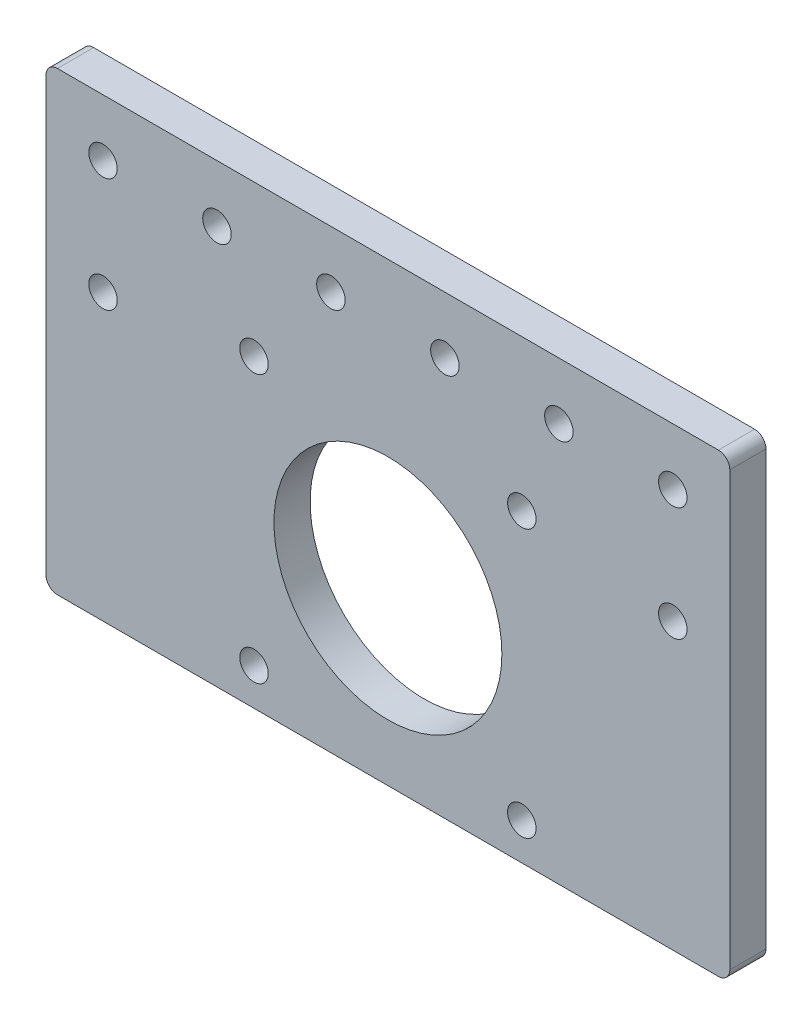
ISO-10303-21;
HEADER;
FILE_DESCRIPTION(('STEP AP214'),'2;1');
FILE_NAME('part.step','',(''),(''),'','','');
FILE_SCHEMA(('AUTOMOTIVE_DESIGN { 1 0 10303 214 1 1 1 1 }'));
ENDSEC;
DATA;
#1=APPLICATION_CONTEXT('core data for automotive mechanical design processes');
#2=APPLICATION_PROTOCOL_DEFINITION('international standard','automotive_design',2000,#1);
#3=PRODUCT_CONTEXT('',#1,'mechanical');
#4=PRODUCT('Part','Part','',(#3));
#5=PRODUCT_RELATED_PRODUCT_CATEGORY('part','',(#4));
#6=PRODUCT_DEFINITION_FORMATION('','',#4);
#7=PRODUCT_DEFINITION_CONTEXT('part definition',#1,'design');
#8=PRODUCT_DEFINITION('design','',#6,#7);
#9=PRODUCT_DEFINITION_SHAPE('','',#8);
#10=(LENGTH_UNIT() NAMED_UNIT(*) SI_UNIT(.MILLI.,.METRE.));
#11=(NAMED_UNIT(*) PLANE_ANGLE_UNIT() SI_UNIT($,.RADIAN.));
#12=(NAMED_UNIT(*) SI_UNIT($,.STERADIAN.) SOLID_ANGLE_UNIT());
#13=UNCERTAINTY_MEASURE_WITH_UNIT(LENGTH_MEASURE(1.E-05),#10,'distance_accuracy_value','');
#14=(GEOMETRIC_REPRESENTATION_CONTEXT(3) GLOBAL_UNCERTAINTY_ASSIGNED_CONTEXT((#13)) GLOBAL_UNIT_ASSIGNED_CONTEXT((#10,
#11,#12)) REPRESENTATION_CONTEXT('',''));
#15=CARTESIAN_POINT('',(0.,0.,0.));
#16=DIRECTION('',(0.,0.,1.));
#17=DIRECTION('',(1.,0.,0.));
#18=AXIS2_PLACEMENT_3D('',#15,#16,#17);
#19=CARTESIAN_POINT('',(0.,0.,6.35));
#20=DIRECTION('',(0.,0.,1.));
#21=DIRECTION('',(1.,0.,0.));
#22=AXIS2_PLACEMENT_3D('',#19,#20,#21);
#23=PLANE('',#22);
#24=CARTESIAN_POINT('',(23.5000000000005,-33.4999999999995,6.35));
#25=DIRECTION('',(0.,0.,1.));
#26=DIRECTION('',(1.,0.,0.));
#27=AXIS2_PLACEMENT_3D('',#24,#25,#26);
#28=CIRCLE('',#27,2.5);
#29=CARTESIAN_POINT('',(26.0000000000005,-33.4999999999995,6.35));
#30=VERTEX_POINT('',#29);
#31=EDGE_CURVE('E244',#30,#30,#28,.T.);
#32=ORIENTED_EDGE('',*,*,#31,.F.);
#33=EDGE_LOOP('',(#32));
#34=FACE_BOUND('',#33,.T.);
#35=CARTESIAN_POINT('',(-23.5,13.5,6.35));
#36=DIRECTION('',(0.,0.,1.));
#37=DIRECTION('',(1.,0.,0.));
#38=AXIS2_PLACEMENT_3D('',#35,#36,#37);
#39=CIRCLE('',#38,2.5);
#40=CARTESIAN_POINT('',(-21.,13.5,6.35));
#41=VERTEX_POINT('',#40);
#42=EDGE_CURVE('E232',#41,#41,#39,.T.);
#43=ORIENTED_EDGE('',*,*,#42,.F.);
#44=EDGE_LOOP('',(#43));
#45=FACE_BOUND('',#44,.T.);
#46=CARTESIAN_POINT('',(50.0000000000002,10.,6.35));
#47=DIRECTION('',(0.,0.,1.));
#48=DIRECTION('',(1.,0.,0.));
#49=AXIS2_PLACEMENT_3D('',#46,#47,#48);
#50=CIRCLE('',#49,2.5);
#51=CARTESIAN_POINT('',(52.5000000000002,10.,6.35));
#52=VERTEX_POINT('',#51);
#53=EDGE_CURVE('E220',#52,#52,#50,.T.);
#54=ORIENTED_EDGE('',*,*,#53,.F.);
#55=EDGE_LOOP('',(#54));
#56=FACE_BOUND('',#55,.T.);
#57=CARTESIAN_POINT('',(50.,30.,6.35));
#58=DIRECTION('',(0.,0.,1.));
#59=DIRECTION('',(1.,0.,0.));
#60=AXIS2_PLACEMENT_3D('',#57,#58,#59);
#61=CIRCLE('',#60,2.5);
#62=CARTESIAN_POINT('',(52.5,30.,6.35));
#63=VERTEX_POINT('',#62);
#64=EDGE_CURVE('E208',#63,#63,#61,.T.);
#65=ORIENTED_EDGE('',*,*,#64,.F.);
#66=EDGE_LOOP('',(#65));
#67=FACE_BOUND('',#66,.T.);
#68=CARTESIAN_POINT('',(10.,30.,6.35));
#69=DIRECTION('',(0.,0.,1.));
#70=DIRECTION('',(1.,0.,0.));
#71=AXIS2_PLACEMENT_3D('',#68,#69,#70);
#72=CIRCLE('',#71,2.5);
#73=CARTESIAN_POINT('',(12.5,30.,6.35));
#74=VERTEX_POINT('',#73);
#75=EDGE_CURVE('E196',#74,#74,#72,.T.);
#76=ORIENTED_EDGE('',*,*,#75,.F.);
#77=EDGE_LOOP('',(#76));
#78=FACE_BOUND('',#77,.T.);
#79=CARTESIAN_POINT('',(-30.,30.,6.35));
#80=DIRECTION('',(0.,0.,1.));
#81=DIRECTION('',(1.,0.,0.));
#82=AXIS2_PLACEMENT_3D('',#79,#80,#81);
#83=CIRCLE('',#82,2.5);
#84=CARTESIAN_POINT('',(-27.5,30.,6.35));
#85=VERTEX_POINT('',#84);
#86=EDGE_CURVE('E185',#85,#85,#83,.T.);
#87=ORIENTED_EDGE('',*,*,#86,.F.);
#88=EDGE_LOOP('',(#87));
#89=FACE_BOUND('',#88,.T.);
#90=DIRECTION('',(1.,0.,0.));
#91=VECTOR('',#90,1.);
#92=CARTESIAN_POINT('',(-60.,-40.,6.35));
#93=LINE('',#92,#91);
#94=CARTESIAN_POINT('',(-58.,-40.,6.35));
#95=VERTEX_POINT('',#94);
#96=CARTESIAN_POINT('',(58.,-40.,6.35));
#97=VERTEX_POINT('',#96);
#98=EDGE_CURVE('E137',#95,#97,#93,.T.);
#99=ORIENTED_EDGE('',*,*,#98,.T.);
#100=CARTESIAN_POINT('',(58.,-38.,6.35));
#101=DIRECTION('',(0.,0.,1.));
#102=DIRECTION('',(1.,0.,0.));
#103=AXIS2_PLACEMENT_3D('',#100,#101,#102);
#104=CIRCLE('',#103,2.);
#105=CARTESIAN_POINT('',(60.,-38.,6.35));
#106=VERTEX_POINT('',#105);
#107=EDGE_CURVE('E155',#97,#106,#104,.T.);
#108=ORIENTED_EDGE('',*,*,#107,.T.);
#109=DIRECTION('',(0.,1.,0.));
#110=VECTOR('',#109,1.);
#111=CARTESIAN_POINT('',(60.,40.,6.35));
#112=LINE('',#111,#110);
#113=CARTESIAN_POINT('',(60.,38.,6.35));
#114=VERTEX_POINT('',#113);
#115=EDGE_CURVE('E119',#106,#114,#112,.T.);
#116=ORIENTED_EDGE('',*,*,#115,.T.);
#117=CARTESIAN_POINT('',(58.,38.,6.35));
#118=DIRECTION('',(0.,0.,1.));
#119=DIRECTION('',(1.,0.,0.));
#120=AXIS2_PLACEMENT_3D('',#117,#118,#119);
#121=CIRCLE('',#120,2.);
#122=CARTESIAN_POINT('',(58.,40.,6.35));
#123=VERTEX_POINT('',#122);
#124=EDGE_CURVE('E151',#114,#123,#121,.T.);
#125=ORIENTED_EDGE('',*,*,#124,.T.);
#126=DIRECTION('',(-1.,0.,0.));
#127=VECTOR('',#126,1.);
#128=CARTESIAN_POINT('',(-60.,40.,6.35));
#129=LINE('',#128,#127);
#130=CARTESIAN_POINT('',(-58.,40.,6.35));
#131=VERTEX_POINT('',#130);
#132=EDGE_CURVE('E164',#123,#131,#129,.T.);
#133=ORIENTED_EDGE('',*,*,#132,.T.);
#134=CARTESIAN_POINT('',(-58.,38.,6.35));
#135=DIRECTION('',(0.,0.,1.));
#136=DIRECTION('',(1.,0.,0.));
#137=AXIS2_PLACEMENT_3D('',#134,#135,#136);
#138=CIRCLE('',#137,2.);
#139=CARTESIAN_POINT('',(-60.,38.,6.35));
#140=VERTEX_POINT('',#139);
#141=EDGE_CURVE('E54',#131,#140,#138,.T.);
#142=ORIENTED_EDGE('',*,*,#141,.T.);
#143=DIRECTION('',(0.,-1.,0.));
#144=VECTOR('',#143,1.);
#145=CARTESIAN_POINT('',(-60.,40.,6.35));
#146=LINE('',#145,#144);
#147=CARTESIAN_POINT('',(-60.,-38.,6.35));
#148=VERTEX_POINT('',#147);
#149=EDGE_CURVE('E170',#140,#148,#146,.T.);
#150=ORIENTED_EDGE('',*,*,#149,.T.);
#151=CARTESIAN_POINT('',(-58.,-38.,6.35));
#152=DIRECTION('',(0.,0.,1.));
#153=DIRECTION('',(1.,0.,0.));
#154=AXIS2_PLACEMENT_3D('',#151,#152,#153);
#155=CIRCLE('',#154,2.);
#156=EDGE_CURVE('E153',#148,#95,#155,.T.);
#157=ORIENTED_EDGE('',*,*,#156,.T.);
#158=EDGE_LOOP('',(#99,#108,#116,#125,#133,#142,#150,#157));
#159=FACE_BOUND('',#158,.T.);
#160=CARTESIAN_POINT('',(-50.,30.,6.35));
#161=DIRECTION('',(0.,0.,1.));
#162=DIRECTION('',(1.,0.,0.));
#163=AXIS2_PLACEMENT_3D('',#160,#161,#162);
#164=CIRCLE('',#163,2.5);
#165=CARTESIAN_POINT('',(-47.5,30.,6.35));
#166=VERTEX_POINT('',#165);
#167=EDGE_CURVE('E128',#166,#166,#164,.T.);
#168=ORIENTED_EDGE('',*,*,#167,.F.);
#169=EDGE_LOOP('',(#168));
#170=FACE_BOUND('',#169,.T.);
#171=CARTESIAN_POINT('',(-9.99999999999997,30.,6.35));
#172=DIRECTION('',(0.,0.,1.));
#173=DIRECTION('',(1.,0.,0.));
#174=AXIS2_PLACEMENT_3D('',#171,#172,#173);
#175=CIRCLE('',#174,2.5);
#176=CARTESIAN_POINT('',(-7.49999999999997,30.,6.35));
#177=VERTEX_POINT('',#176);
#178=EDGE_CURVE('E190',#177,#177,#175,.T.);
#179=ORIENTED_EDGE('',*,*,#178,.F.);
#180=EDGE_LOOP('',(#179));
#181=FACE_BOUND('',#180,.T.);
#182=CARTESIAN_POINT('',(30.,30.,6.35));
#183=DIRECTION('',(0.,0.,1.));
#184=DIRECTION('',(1.,0.,0.));
#185=AXIS2_PLACEMENT_3D('',#182,#183,#184);
#186=CIRCLE('',#185,2.5);
#187=CARTESIAN_POINT('',(32.5,30.,6.35));
#188=VERTEX_POINT('',#187);
#189=EDGE_CURVE('E202',#188,#188,#186,.T.);
#190=ORIENTED_EDGE('',*,*,#189,.F.);
#191=EDGE_LOOP('',(#190));
#192=FACE_BOUND('',#191,.T.);
#193=CARTESIAN_POINT('',(-49.9999999999998,10.,6.35));
#194=DIRECTION('',(0.,0.,1.));
#195=DIRECTION('',(1.,0.,0.));
#196=AXIS2_PLACEMENT_3D('',#193,#194,#195);
#197=CIRCLE('',#196,2.5);
#198=CARTESIAN_POINT('',(-47.4999999999998,10.,6.35));
#199=VERTEX_POINT('',#198);
#200=EDGE_CURVE('E214',#199,#199,#197,.T.);
#201=ORIENTED_EDGE('',*,*,#200,.F.);
#202=EDGE_LOOP('',(#201));
#203=FACE_BOUND('',#202,.T.);
#204=CARTESIAN_POINT('',(0.,-10.,6.35));
#205=DIRECTION('',(0.,0.,1.));
#206=DIRECTION('',(1.,0.,0.));
#207=AXIS2_PLACEMENT_3D('',#204,#205,#206);
#208=CIRCLE('',#207,20.);
#209=CARTESIAN_POINT('',(20.,-10.,6.35));
#210=VERTEX_POINT('',#209);
#211=EDGE_CURVE('E226',#210,#210,#208,.T.);
#212=ORIENTED_EDGE('',*,*,#211,.F.);
#213=EDGE_LOOP('',(#212));
#214=FACE_BOUND('',#213,.T.);
#215=CARTESIAN_POINT('',(23.5000000000001,13.5000000000006,6.35));
#216=DIRECTION('',(0.,0.,1.));
#217=DIRECTION('',(1.,0.,0.));
#218=AXIS2_PLACEMENT_3D('',#215,#216,#217);
#219=CIRCLE('',#218,2.5);
#220=CARTESIAN_POINT('',(26.0000000000001,13.5000000000006,6.35));
#221=VERTEX_POINT('',#220);
#222=EDGE_CURVE('E238',#221,#221,#219,.T.);
#223=ORIENTED_EDGE('',*,*,#222,.F.);
#224=EDGE_LOOP('',(#223));
#225=FACE_BOUND('',#224,.T.);
#226=CARTESIAN_POINT('',(-23.4999999999996,-33.4999999999998,6.35));
#227=DIRECTION('',(0.,0.,1.));
#228=DIRECTION('',(1.,0.,0.));
#229=AXIS2_PLACEMENT_3D('',#226,#227,#228);
#230=CIRCLE('',#229,2.5);
#231=CARTESIAN_POINT('',(-20.9999999999996,-33.4999999999998,6.35));
#232=VERTEX_POINT('',#231);
#233=EDGE_CURVE('E250',#232,#232,#230,.T.);
#234=ORIENTED_EDGE('',*,*,#233,.F.);
#235=EDGE_LOOP('',(#234));
#236=FACE_BOUND('',#235,.T.);
#237=ADVANCED_FACE('F32',(#34,#45,#56,#67,#78,#89,#159,#170,#181,#192,#203,#214,#225,#236),#23,.T.);
#238=CARTESIAN_POINT('',(0.,0.,0.));
#239=DIRECTION('',(0.,0.,1.));
#240=DIRECTION('',(1.,0.,0.));
#241=AXIS2_PLACEMENT_3D('',#238,#239,#240);
#242=PLANE('',#241);
#243=DIRECTION('',(0.,1.,0.));
#244=VECTOR('',#243,1.);
#245=CARTESIAN_POINT('',(60.,40.,0.));
#246=LINE('',#245,#244);
#247=CARTESIAN_POINT('',(60.,-38.,0.));
#248=VERTEX_POINT('',#247);
#249=CARTESIAN_POINT('',(60.,38.,0.));
#250=VERTEX_POINT('',#249);
#251=EDGE_CURVE('E116',#248,#250,#246,.T.);
#252=ORIENTED_EDGE('',*,*,#251,.F.);
#253=CARTESIAN_POINT('',(58.,-38.,0.));
#254=DIRECTION('',(0.,0.,1.));
#255=DIRECTION('',(1.,0.,0.));
#256=AXIS2_PLACEMENT_3D('',#253,#254,#255);
#257=CIRCLE('',#256,2.);
#258=CARTESIAN_POINT('',(58.,-40.,0.));
#259=VERTEX_POINT('',#258);
#260=EDGE_CURVE('E99',#248,#259,#257,.F.);
#261=ORIENTED_EDGE('',*,*,#260,.T.);
#262=DIRECTION('',(1.,0.,0.));
#263=VECTOR('',#262,1.);
#264=CARTESIAN_POINT('',(-60.,-40.,0.));
#265=LINE('',#264,#263);
#266=CARTESIAN_POINT('',(-58.,-40.,0.));
#267=VERTEX_POINT('',#266);
#268=EDGE_CURVE('E141',#267,#259,#265,.T.);
#269=ORIENTED_EDGE('',*,*,#268,.F.);
#270=CARTESIAN_POINT('',(-58.,-38.,0.));
#271=DIRECTION('',(0.,0.,1.));
#272=DIRECTION('',(1.,0.,0.));
#273=AXIS2_PLACEMENT_3D('',#270,#271,#272);
#274=CIRCLE('',#273,2.);
#275=CARTESIAN_POINT('',(-60.,-38.,0.));
#276=VERTEX_POINT('',#275);
#277=EDGE_CURVE('E110',#267,#276,#274,.F.);
#278=ORIENTED_EDGE('',*,*,#277,.T.);
#279=DIRECTION('',(0.,-1.,0.));
#280=VECTOR('',#279,1.);
#281=CARTESIAN_POINT('',(-60.,40.,0.));
#282=LINE('',#281,#280);
#283=CARTESIAN_POINT('',(-60.,38.,0.));
#284=VERTEX_POINT('',#283);
#285=EDGE_CURVE('E131',#284,#276,#282,.T.);
#286=ORIENTED_EDGE('',*,*,#285,.F.);
#287=CARTESIAN_POINT('',(-58.,38.,0.));
#288=DIRECTION('',(0.,0.,1.));
#289=DIRECTION('',(1.,0.,0.));
#290=AXIS2_PLACEMENT_3D('',#287,#288,#289);
#291=CIRCLE('',#290,2.);
#292=CARTESIAN_POINT('',(-58.,40.,0.));
#293=VERTEX_POINT('',#292);
#294=EDGE_CURVE('E120',#284,#293,#291,.F.);
#295=ORIENTED_EDGE('',*,*,#294,.T.);
#296=DIRECTION('',(-1.,0.,0.));
#297=VECTOR('',#296,1.);
#298=CARTESIAN_POINT('',(-60.,40.,0.));
#299=LINE('',#298,#297);
#300=CARTESIAN_POINT('',(58.,40.,0.));
#301=VERTEX_POINT('',#300);
#302=EDGE_CURVE('E127',#301,#293,#299,.T.);
#303=ORIENTED_EDGE('',*,*,#302,.F.);
#304=CARTESIAN_POINT('',(58.,38.,0.));
#305=DIRECTION('',(0.,0.,1.));
#306=DIRECTION('',(1.,0.,0.));
#307=AXIS2_PLACEMENT_3D('',#304,#305,#306);
#308=CIRCLE('',#307,2.);
#309=EDGE_CURVE('E126',#301,#250,#308,.F.);
#310=ORIENTED_EDGE('',*,*,#309,.T.);
#311=EDGE_LOOP('',(#252,#261,#269,#278,#286,#295,#303,#310));
#312=FACE_BOUND('',#311,.T.);
#313=CARTESIAN_POINT('',(-50.,30.,0.));
#314=DIRECTION('',(0.,0.,1.));
#315=DIRECTION('',(1.,0.,0.));
#316=AXIS2_PLACEMENT_3D('',#313,#314,#315);
#317=CIRCLE('',#316,2.5);
#318=CARTESIAN_POINT('',(-47.5,30.,0.));
#319=VERTEX_POINT('',#318);
#320=EDGE_CURVE('E134',#319,#319,#317,.T.);
#321=ORIENTED_EDGE('',*,*,#320,.T.);
#322=EDGE_LOOP('',(#321));
#323=FACE_BOUND('',#322,.T.);
#324=CARTESIAN_POINT('',(-30.,30.,0.));
#325=DIRECTION('',(0.,0.,1.));
#326=DIRECTION('',(1.,0.,0.));
#327=AXIS2_PLACEMENT_3D('',#324,#325,#326);
#328=CIRCLE('',#327,2.5);
#329=CARTESIAN_POINT('',(-27.5,30.,0.));
#330=VERTEX_POINT('',#329);
#331=EDGE_CURVE('E187',#330,#330,#328,.T.);
#332=ORIENTED_EDGE('',*,*,#331,.T.);
#333=EDGE_LOOP('',(#332));
#334=FACE_BOUND('',#333,.T.);
#335=CARTESIAN_POINT('',(-9.99999999999997,30.,0.));
#336=DIRECTION('',(0.,0.,1.));
#337=DIRECTION('',(1.,0.,0.));
#338=AXIS2_PLACEMENT_3D('',#335,#336,#337);
#339=CIRCLE('',#338,2.5);
#340=CARTESIAN_POINT('',(-7.49999999999997,30.,0.));
#341=VERTEX_POINT('',#340);
#342=EDGE_CURVE('E193',#341,#341,#339,.T.);
#343=ORIENTED_EDGE('',*,*,#342,.T.);
#344=EDGE_LOOP('',(#343));
#345=FACE_BOUND('',#344,.T.);
#346=CARTESIAN_POINT('',(10.,30.,0.));
#347=DIRECTION('',(0.,0.,1.));
#348=DIRECTION('',(1.,0.,0.));
#349=AXIS2_PLACEMENT_3D('',#346,#347,#348);
#350=CIRCLE('',#349,2.5);
#351=CARTESIAN_POINT('',(12.5,30.,0.));
#352=VERTEX_POINT('',#351);
#353=EDGE_CURVE('E199',#352,#352,#350,.T.);
#354=ORIENTED_EDGE('',*,*,#353,.T.);
#355=EDGE_LOOP('',(#354));
#356=FACE_BOUND('',#355,.T.);
#357=CARTESIAN_POINT('',(30.,30.,0.));
#358=DIRECTION('',(0.,0.,1.));
#359=DIRECTION('',(1.,0.,0.));
#360=AXIS2_PLACEMENT_3D('',#357,#358,#359);
#361=CIRCLE('',#360,2.5);
#362=CARTESIAN_POINT('',(32.5,30.,0.));
#363=VERTEX_POINT('',#362);
#364=EDGE_CURVE('E205',#363,#363,#361,.T.);
#365=ORIENTED_EDGE('',*,*,#364,.T.);
#366=EDGE_LOOP('',(#365));
#367=FACE_BOUND('',#366,.T.);
#368=CARTESIAN_POINT('',(50.,30.,0.));
#369=DIRECTION('',(0.,0.,1.));
#370=DIRECTION('',(1.,0.,0.));
#371=AXIS2_PLACEMENT_3D('',#368,#369,#370);
#372=CIRCLE('',#371,2.5);
#373=CARTESIAN_POINT('',(52.5,30.,0.));
#374=VERTEX_POINT('',#373);
#375=EDGE_CURVE('E211',#374,#374,#372,.T.);
#376=ORIENTED_EDGE('',*,*,#375,.T.);
#377=EDGE_LOOP('',(#376));
#378=FACE_BOUND('',#377,.T.);
#379=CARTESIAN_POINT('',(-49.9999999999998,10.,0.));
#380=DIRECTION('',(0.,0.,1.));
#381=DIRECTION('',(1.,0.,0.));
#382=AXIS2_PLACEMENT_3D('',#379,#380,#381);
#383=CIRCLE('',#382,2.5);
#384=CARTESIAN_POINT('',(-47.4999999999998,10.,0.));
#385=VERTEX_POINT('',#384);
#386=EDGE_CURVE('E217',#385,#385,#383,.T.);
#387=ORIENTED_EDGE('',*,*,#386,.T.);
#388=EDGE_LOOP('',(#387));
#389=FACE_BOUND('',#388,.T.);
#390=CARTESIAN_POINT('',(50.0000000000002,10.,0.));
#391=DIRECTION('',(0.,0.,1.));
#392=DIRECTION('',(1.,0.,0.));
#393=AXIS2_PLACEMENT_3D('',#390,#391,#392);
#394=CIRCLE('',#393,2.5);
#395=CARTESIAN_POINT('',(52.5000000000002,10.,0.));
#396=VERTEX_POINT('',#395);
#397=EDGE_CURVE('E223',#396,#396,#394,.T.);
#398=ORIENTED_EDGE('',*,*,#397,.T.);
#399=EDGE_LOOP('',(#398));
#400=FACE_BOUND('',#399,.T.);
#401=CARTESIAN_POINT('',(0.,-10.,0.));
#402=DIRECTION('',(0.,0.,1.));
#403=DIRECTION('',(1.,0.,0.));
#404=AXIS2_PLACEMENT_3D('',#401,#402,#403);
#405=CIRCLE('',#404,20.);
#406=CARTESIAN_POINT('',(20.,-10.,0.));
#407=VERTEX_POINT('',#406);
#408=EDGE_CURVE('E229',#407,#407,#405,.T.);
#409=ORIENTED_EDGE('',*,*,#408,.T.);
#410=EDGE_LOOP('',(#409));
#411=FACE_BOUND('',#410,.T.);
#412=CARTESIAN_POINT('',(-23.5,13.5,0.));
#413=DIRECTION('',(0.,0.,1.));
#414=DIRECTION('',(1.,0.,0.));
#415=AXIS2_PLACEMENT_3D('',#412,#413,#414);
#416=CIRCLE('',#415,2.5);
#417=CARTESIAN_POINT('',(-21.,13.5,0.));
#418=VERTEX_POINT('',#417);
#419=EDGE_CURVE('E235',#418,#418,#416,.T.);
#420=ORIENTED_EDGE('',*,*,#419,.T.);
#421=EDGE_LOOP('',(#420));
#422=FACE_BOUND('',#421,.T.);
#423=CARTESIAN_POINT('',(23.5000000000001,13.5000000000006,0.));
#424=DIRECTION('',(0.,0.,1.));
#425=DIRECTION('',(1.,0.,0.));
#426=AXIS2_PLACEMENT_3D('',#423,#424,#425);
#427=CIRCLE('',#426,2.5);
#428=CARTESIAN_POINT('',(26.0000000000001,13.5000000000006,0.));
#429=VERTEX_POINT('',#428);
#430=EDGE_CURVE('E241',#429,#429,#427,.T.);
#431=ORIENTED_EDGE('',*,*,#430,.T.);
#432=EDGE_LOOP('',(#431));
#433=FACE_BOUND('',#432,.T.);
#434=CARTESIAN_POINT('',(23.5000000000005,-33.4999999999995,0.));
#435=DIRECTION('',(0.,0.,1.));
#436=DIRECTION('',(1.,0.,0.));
#437=AXIS2_PLACEMENT_3D('',#434,#435,#436);
#438=CIRCLE('',#437,2.5);
#439=CARTESIAN_POINT('',(26.0000000000005,-33.4999999999995,0.));
#440=VERTEX_POINT('',#439);
#441=EDGE_CURVE('E247',#440,#440,#438,.T.);
#442=ORIENTED_EDGE('',*,*,#441,.T.);
#443=EDGE_LOOP('',(#442));
#444=FACE_BOUND('',#443,.T.);
#445=CARTESIAN_POINT('',(-23.4999999999996,-33.4999999999998,0.));
#446=DIRECTION('',(0.,0.,1.));
#447=DIRECTION('',(1.,0.,0.));
#448=AXIS2_PLACEMENT_3D('',#445,#446,#447);
#449=CIRCLE('',#448,2.5);
#450=CARTESIAN_POINT('',(-20.9999999999996,-33.4999999999998,0.));
#451=VERTEX_POINT('',#450);
#452=EDGE_CURVE('E253',#451,#451,#449,.T.);
#453=ORIENTED_EDGE('',*,*,#452,.T.);
#454=EDGE_LOOP('',(#453));
#455=FACE_BOUND('',#454,.T.);
#456=ADVANCED_FACE('F123',(#312,#323,#334,#345,#356,#367,#378,#389,#400,#411,#422,#433,#444,
#455),#242,.F.);
#457=CARTESIAN_POINT('',(60.,40.,6.35));
#458=DIRECTION('',(-1.,0.,0.));
#459=DIRECTION('',(0.,-1.,0.));
#460=AXIS2_PLACEMENT_3D('',#457,#458,#459);
#461=PLANE('',#460);
#462=ORIENTED_EDGE('',*,*,#115,.F.);
#463=DIRECTION('',(0.,0.,-1.));
#464=VECTOR('',#463,1.);
#465=CARTESIAN_POINT('',(60.,-38.,6.35));
#466=LINE('',#465,#464);
#467=EDGE_CURVE('E103',#106,#248,#466,.T.);
#468=ORIENTED_EDGE('',*,*,#467,.T.);
#469=ORIENTED_EDGE('',*,*,#251,.T.);
#470=DIRECTION('',(0.,0.,-1.));
#471=VECTOR('',#470,1.);
#472=CARTESIAN_POINT('',(60.,38.,6.35));
#473=LINE('',#472,#471);
#474=EDGE_CURVE('E121',#250,#114,#473,.F.);
#475=ORIENTED_EDGE('',*,*,#474,.T.);
#476=EDGE_LOOP('',(#462,#468,#469,#475));
#477=FACE_BOUND('',#476,.T.);
#478=ADVANCED_FACE('F115',(#477),#461,.F.);
#479=CARTESIAN_POINT('',(-60.,40.,6.35));
#480=DIRECTION('',(0.,-1.,0.));
#481=DIRECTION('',(0.,0.,-1.));
#482=AXIS2_PLACEMENT_3D('',#479,#480,#481);
#483=PLANE('',#482);
#484=ORIENTED_EDGE('',*,*,#132,.F.);
#485=DIRECTION('',(0.,0.,-1.));
#486=VECTOR('',#485,1.);
#487=CARTESIAN_POINT('',(58.,40.,6.35));
#488=LINE('',#487,#486);
#489=EDGE_CURVE('E11',#123,#301,#488,.T.);
#490=ORIENTED_EDGE('',*,*,#489,.T.);
#491=ORIENTED_EDGE('',*,*,#302,.T.);
#492=DIRECTION('',(0.,0.,-1.));
#493=VECTOR('',#492,1.);
#494=CARTESIAN_POINT('',(-58.,40.,6.35));
#495=LINE('',#494,#493);
#496=EDGE_CURVE('E40',#293,#131,#495,.F.);
#497=ORIENTED_EDGE('',*,*,#496,.T.);
#498=EDGE_LOOP('',(#484,#490,#491,#497));
#499=FACE_BOUND('',#498,.T.);
#500=ADVANCED_FACE('F163',(#499),#483,.F.);
#501=CARTESIAN_POINT('',(-60.,40.,6.35));
#502=DIRECTION('',(1.,0.,0.));
#503=DIRECTION('',(0.,1.,0.));
#504=AXIS2_PLACEMENT_3D('',#501,#502,#503);
#505=PLANE('',#504);
#506=ORIENTED_EDGE('',*,*,#285,.T.);
#507=DIRECTION('',(0.,0.,-1.));
#508=VECTOR('',#507,1.);
#509=CARTESIAN_POINT('',(-60.,-38.,6.35));
#510=LINE('',#509,#508);
#511=EDGE_CURVE('E47',#276,#148,#510,.F.);
#512=ORIENTED_EDGE('',*,*,#511,.T.);
#513=ORIENTED_EDGE('',*,*,#149,.F.);
#514=DIRECTION('',(0.,0.,-1.));
#515=VECTOR('',#514,1.);
#516=CARTESIAN_POINT('',(-60.,38.,6.35));
#517=LINE('',#516,#515);
#518=EDGE_CURVE('E157',#140,#284,#517,.T.);
#519=ORIENTED_EDGE('',*,*,#518,.T.);
#520=EDGE_LOOP('',(#506,#512,#513,#519));
#521=FACE_BOUND('',#520,.T.);
#522=ADVANCED_FACE('F174',(#521),#505,.F.);
#523=CARTESIAN_POINT('',(-60.,-40.,6.35));
#524=DIRECTION('',(0.,1.,0.));
#525=DIRECTION('',(0.,0.,1.));
#526=AXIS2_PLACEMENT_3D('',#523,#524,#525);
#527=PLANE('',#526);
#528=ORIENTED_EDGE('',*,*,#268,.T.);
#529=DIRECTION('',(0.,0.,-1.));
#530=VECTOR('',#529,1.);
#531=CARTESIAN_POINT('',(58.,-40.,6.35));
#532=LINE('',#531,#530);
#533=EDGE_CURVE('E104',#259,#97,#532,.F.);
#534=ORIENTED_EDGE('',*,*,#533,.T.);
#535=ORIENTED_EDGE('',*,*,#98,.F.);
#536=DIRECTION('',(0.,0.,-1.));
#537=VECTOR('',#536,1.);
#538=CARTESIAN_POINT('',(-58.,-40.,6.35));
#539=LINE('',#538,#537);
#540=EDGE_CURVE('E109',#95,#267,#539,.T.);
#541=ORIENTED_EDGE('',*,*,#540,.T.);
#542=EDGE_LOOP('',(#528,#534,#535,#541));
#543=FACE_BOUND('',#542,.T.);
#544=ADVANCED_FACE('F181',(#543),#527,.F.);
#545=CARTESIAN_POINT('',(-50.,30.,6.35));
#546=DIRECTION('',(0.,0.,-1.));
#547=DIRECTION('',(-1.,0.,0.));
#548=AXIS2_PLACEMENT_3D('',#545,#546,#547);
#549=CYLINDRICAL_SURFACE('',#548,2.5);
#550=ORIENTED_EDGE('',*,*,#167,.T.);
#551=EDGE_LOOP('',(#550));
#552=FACE_BOUND('',#551,.T.);
#553=ORIENTED_EDGE('',*,*,#320,.F.);
#554=EDGE_LOOP('',(#553));
#555=FACE_BOUND('',#554,.T.);
#556=ADVANCED_FACE('F272',(#552,#555),#549,.F.);
#557=CARTESIAN_POINT('',(-30.,30.,6.35));
#558=DIRECTION('',(0.,0.,-1.));
#559=DIRECTION('',(-1.,0.,0.));
#560=AXIS2_PLACEMENT_3D('',#557,#558,#559);
#561=CYLINDRICAL_SURFACE('',#560,2.5);
#562=ORIENTED_EDGE('',*,*,#86,.T.);
#563=EDGE_LOOP('',(#562));
#564=FACE_BOUND('',#563,.T.);
#565=ORIENTED_EDGE('',*,*,#331,.F.);
#566=EDGE_LOOP('',(#565));
#567=FACE_BOUND('',#566,.T.);
#568=ADVANCED_FACE('F454',(#564,#567),#561,.F.);
#569=CARTESIAN_POINT('',(-9.99999999999997,30.,6.35));
#570=DIRECTION('',(0.,0.,-1.));
#571=DIRECTION('',(-1.,0.,0.));
#572=AXIS2_PLACEMENT_3D('',#569,#570,#571);
#573=CYLINDRICAL_SURFACE('',#572,2.5);
#574=ORIENTED_EDGE('',*,*,#178,.T.);
#575=EDGE_LOOP('',(#574));
#576=FACE_BOUND('',#575,.T.);
#577=ORIENTED_EDGE('',*,*,#342,.F.);
#578=EDGE_LOOP('',(#577));
#579=FACE_BOUND('',#578,.T.);
#580=ADVANCED_FACE('F444',(#576,#579),#573,.F.);
#581=CARTESIAN_POINT('',(10.,30.,6.35));
#582=DIRECTION('',(0.,0.,-1.));
#583=DIRECTION('',(-1.,0.,0.));
#584=AXIS2_PLACEMENT_3D('',#581,#582,#583);
#585=CYLINDRICAL_SURFACE('',#584,2.5);
#586=ORIENTED_EDGE('',*,*,#75,.T.);
#587=EDGE_LOOP('',(#586));
#588=FACE_BOUND('',#587,.T.);
#589=ORIENTED_EDGE('',*,*,#353,.F.);
#590=EDGE_LOOP('',(#589));
#591=FACE_BOUND('',#590,.T.);
#592=ADVANCED_FACE('F434',(#588,#591),#585,.F.);
#593=CARTESIAN_POINT('',(30.,30.,6.35));
#594=DIRECTION('',(0.,0.,-1.));
#595=DIRECTION('',(-1.,0.,0.));
#596=AXIS2_PLACEMENT_3D('',#593,#594,#595);
#597=CYLINDRICAL_SURFACE('',#596,2.5);
#598=ORIENTED_EDGE('',*,*,#189,.T.);
#599=EDGE_LOOP('',(#598));
#600=FACE_BOUND('',#599,.T.);
#601=ORIENTED_EDGE('',*,*,#364,.F.);
#602=EDGE_LOOP('',(#601));
#603=FACE_BOUND('',#602,.T.);
#604=ADVANCED_FACE('F424',(#600,#603),#597,.F.);
#605=CARTESIAN_POINT('',(50.,30.,6.35));
#606=DIRECTION('',(0.,0.,-1.));
#607=DIRECTION('',(-1.,0.,0.));
#608=AXIS2_PLACEMENT_3D('',#605,#606,#607);
#609=CYLINDRICAL_SURFACE('',#608,2.5);
#610=ORIENTED_EDGE('',*,*,#64,.T.);
#611=EDGE_LOOP('',(#610));
#612=FACE_BOUND('',#611,.T.);
#613=ORIENTED_EDGE('',*,*,#375,.F.);
#614=EDGE_LOOP('',(#613));
#615=FACE_BOUND('',#614,.T.);
#616=ADVANCED_FACE('F414',(#612,#615),#609,.F.);
#617=CARTESIAN_POINT('',(-49.9999999999998,10.,6.35));
#618=DIRECTION('',(0.,0.,-1.));
#619=DIRECTION('',(-1.,0.,0.));
#620=AXIS2_PLACEMENT_3D('',#617,#618,#619);
#621=CYLINDRICAL_SURFACE('',#620,2.5);
#622=ORIENTED_EDGE('',*,*,#200,.T.);
#623=EDGE_LOOP('',(#622));
#624=FACE_BOUND('',#623,.T.);
#625=ORIENTED_EDGE('',*,*,#386,.F.);
#626=EDGE_LOOP('',(#625));
#627=FACE_BOUND('',#626,.T.);
#628=ADVANCED_FACE('F404',(#624,#627),#621,.F.);
#629=CARTESIAN_POINT('',(50.0000000000002,10.,6.35));
#630=DIRECTION('',(0.,0.,-1.));
#631=DIRECTION('',(-1.,0.,0.));
#632=AXIS2_PLACEMENT_3D('',#629,#630,#631);
#633=CYLINDRICAL_SURFACE('',#632,2.5);
#634=ORIENTED_EDGE('',*,*,#53,.T.);
#635=EDGE_LOOP('',(#634));
#636=FACE_BOUND('',#635,.T.);
#637=ORIENTED_EDGE('',*,*,#397,.F.);
#638=EDGE_LOOP('',(#637));
#639=FACE_BOUND('',#638,.T.);
#640=ADVANCED_FACE('F394',(#636,#639),#633,.F.);
#641=CARTESIAN_POINT('',(0.,-10.,6.35));
#642=DIRECTION('',(0.,0.,-1.));
#643=DIRECTION('',(-1.,0.,0.));
#644=AXIS2_PLACEMENT_3D('',#641,#642,#643);
#645=CYLINDRICAL_SURFACE('',#644,20.);
#646=ORIENTED_EDGE('',*,*,#211,.T.);
#647=EDGE_LOOP('',(#646));
#648=FACE_BOUND('',#647,.T.);
#649=ORIENTED_EDGE('',*,*,#408,.F.);
#650=EDGE_LOOP('',(#649));
#651=FACE_BOUND('',#650,.T.);
#652=ADVANCED_FACE('F384',(#648,#651),#645,.F.);
#653=CARTESIAN_POINT('',(-23.5,13.5,6.35));
#654=DIRECTION('',(0.,0.,-1.));
#655=DIRECTION('',(-1.,0.,0.));
#656=AXIS2_PLACEMENT_3D('',#653,#654,#655);
#657=CYLINDRICAL_SURFACE('',#656,2.5);
#658=ORIENTED_EDGE('',*,*,#42,.T.);
#659=EDGE_LOOP('',(#658));
#660=FACE_BOUND('',#659,.T.);
#661=ORIENTED_EDGE('',*,*,#419,.F.);
#662=EDGE_LOOP('',(#661));
#663=FACE_BOUND('',#662,.T.);
#664=ADVANCED_FACE('F374',(#660,#663),#657,.F.);
#665=CARTESIAN_POINT('',(23.5000000000001,13.5000000000006,6.35));
#666=DIRECTION('',(0.,0.,-1.));
#667=DIRECTION('',(-1.,0.,0.));
#668=AXIS2_PLACEMENT_3D('',#665,#666,#667);
#669=CYLINDRICAL_SURFACE('',#668,2.5);
#670=ORIENTED_EDGE('',*,*,#222,.T.);
#671=EDGE_LOOP('',(#670));
#672=FACE_BOUND('',#671,.T.);
#673=ORIENTED_EDGE('',*,*,#430,.F.);
#674=EDGE_LOOP('',(#673));
#675=FACE_BOUND('',#674,.T.);
#676=ADVANCED_FACE('F364',(#672,#675),#669,.F.);
#677=CARTESIAN_POINT('',(23.5000000000005,-33.4999999999995,6.35));
#678=DIRECTION('',(0.,0.,-1.));
#679=DIRECTION('',(-1.,0.,0.));
#680=AXIS2_PLACEMENT_3D('',#677,#678,#679);
#681=CYLINDRICAL_SURFACE('',#680,2.5);
#682=ORIENTED_EDGE('',*,*,#31,.T.);
#683=EDGE_LOOP('',(#682));
#684=FACE_BOUND('',#683,.T.);
#685=ORIENTED_EDGE('',*,*,#441,.F.);
#686=EDGE_LOOP('',(#685));
#687=FACE_BOUND('',#686,.T.);
#688=ADVANCED_FACE('F355',(#684,#687),#681,.F.);
#689=CARTESIAN_POINT('',(-23.4999999999996,-33.4999999999998,6.35));
#690=DIRECTION('',(0.,0.,-1.));
#691=DIRECTION('',(-1.,0.,0.));
#692=AXIS2_PLACEMENT_3D('',#689,#690,#691);
#693=CYLINDRICAL_SURFACE('',#692,2.5);
#694=ORIENTED_EDGE('',*,*,#233,.T.);
#695=EDGE_LOOP('',(#694));
#696=FACE_BOUND('',#695,.T.);
#697=ORIENTED_EDGE('',*,*,#452,.F.);
#698=EDGE_LOOP('',(#697));
#699=FACE_BOUND('',#698,.T.);
#700=ADVANCED_FACE('F259',(#696,#699),#693,.F.);
#701=CARTESIAN_POINT('',(58.,-38.,6.35));
#702=DIRECTION('',(0.,0.,-1.));
#703=DIRECTION('',(-1.,0.,0.));
#704=AXIS2_PLACEMENT_3D('',#701,#702,#703);
#705=CYLINDRICAL_SURFACE('',#704,2.);
#706=ORIENTED_EDGE('',*,*,#107,.F.);
#707=ORIENTED_EDGE('',*,*,#533,.F.);
#708=ORIENTED_EDGE('',*,*,#260,.F.);
#709=ORIENTED_EDGE('',*,*,#467,.F.);
#710=EDGE_LOOP('',(#706,#707,#708,#709));
#711=FACE_BOUND('',#710,.T.);
#712=ADVANCED_FACE('F102',(#711),#705,.T.);
#713=CARTESIAN_POINT('',(-58.,-38.,6.35));
#714=DIRECTION('',(0.,0.,-1.));
#715=DIRECTION('',(-1.,0.,0.));
#716=AXIS2_PLACEMENT_3D('',#713,#714,#715);
#717=CYLINDRICAL_SURFACE('',#716,2.);
#718=ORIENTED_EDGE('',*,*,#156,.F.);
#719=ORIENTED_EDGE('',*,*,#511,.F.);
#720=ORIENTED_EDGE('',*,*,#277,.F.);
#721=ORIENTED_EDGE('',*,*,#540,.F.);
#722=EDGE_LOOP('',(#718,#719,#720,#721));
#723=FACE_BOUND('',#722,.T.);
#724=ADVANCED_FACE('F178',(#723),#717,.T.);
#725=CARTESIAN_POINT('',(58.,38.,6.35));
#726=DIRECTION('',(0.,0.,-1.));
#727=DIRECTION('',(-1.,0.,0.));
#728=AXIS2_PLACEMENT_3D('',#725,#726,#727);
#729=CYLINDRICAL_SURFACE('',#728,2.);
#730=ORIENTED_EDGE('',*,*,#124,.F.);
#731=ORIENTED_EDGE('',*,*,#474,.F.);
#732=ORIENTED_EDGE('',*,*,#309,.F.);
#733=ORIENTED_EDGE('',*,*,#489,.F.);
#734=EDGE_LOOP('',(#730,#731,#732,#733));
#735=FACE_BOUND('',#734,.T.);
#736=ADVANCED_FACE('F286',(#735),#729,.T.);
#737=CARTESIAN_POINT('',(-58.,38.,6.35));
#738=DIRECTION('',(0.,0.,-1.));
#739=DIRECTION('',(-1.,0.,0.));
#740=AXIS2_PLACEMENT_3D('',#737,#738,#739);
#741=CYLINDRICAL_SURFACE('',#740,2.);
#742=ORIENTED_EDGE('',*,*,#141,.F.);
#743=ORIENTED_EDGE('',*,*,#496,.F.);
#744=ORIENTED_EDGE('',*,*,#294,.F.);
#745=ORIENTED_EDGE('',*,*,#518,.F.);
#746=EDGE_LOOP('',(#742,#743,#744,#745));
#747=FACE_BOUND('',#746,.T.);
#748=ADVANCED_FACE('F34',(#747),#741,.T.);
#749=CLOSED_SHELL('',(#237,#456,#478,#500,#522,#544,#556,#568,#580,#592,#604,#616,#628,#640,
#652,#664,#676,#688,#700,#712,#724,#736,#748));
#750=MANIFOLD_SOLID_BREP('B2',#749);
#751=ADVANCED_BREP_SHAPE_REPRESENTATION('',(#18,#750),#14);
#752=SHAPE_DEFINITION_REPRESENTATION(#9,#751);
ENDSEC;
END-ISO-10303-21;
